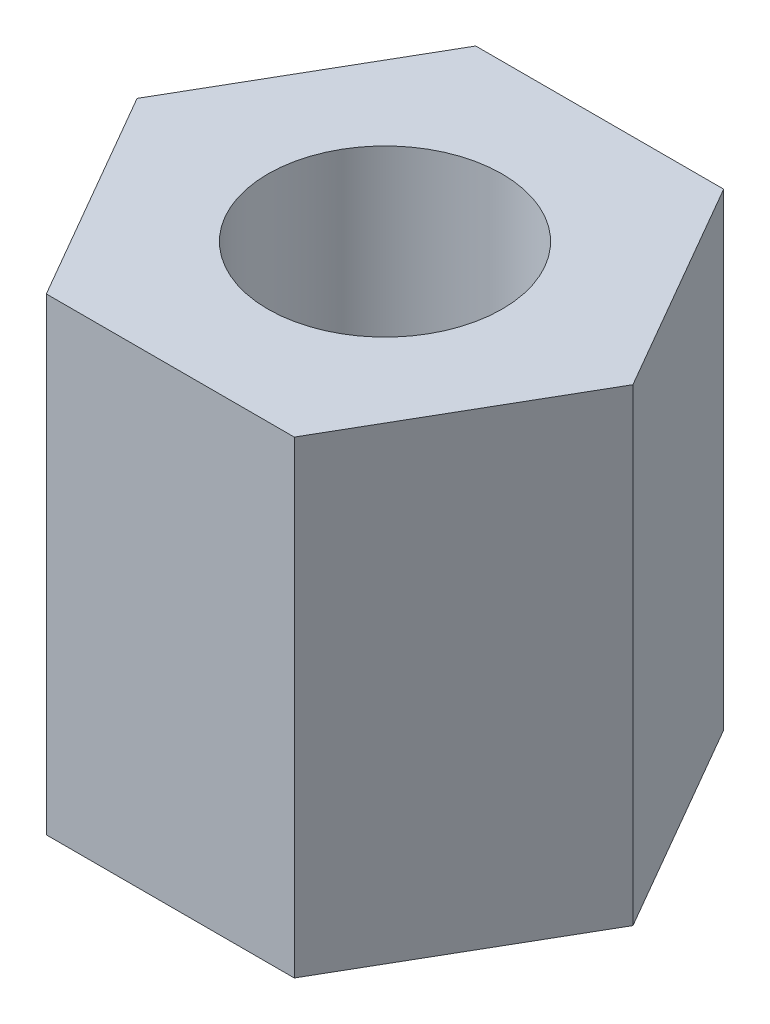
ISO-10303-21;
HEADER;
FILE_DESCRIPTION(('STEP AP214'),'2;1');
FILE_NAME('part.step','',(''),(''),'','','');
FILE_SCHEMA(('AUTOMOTIVE_DESIGN { 1 0 10303 214 1 1 1 1 }'));
ENDSEC;
DATA;
#1=APPLICATION_CONTEXT('core data for automotive mechanical design processes');
#2=APPLICATION_PROTOCOL_DEFINITION('international standard','automotive_design',2000,#1);
#3=PRODUCT_CONTEXT('',#1,'mechanical');
#4=PRODUCT('Part','Part','',(#3));
#5=PRODUCT_RELATED_PRODUCT_CATEGORY('part','',(#4));
#6=PRODUCT_DEFINITION_FORMATION('','',#4);
#7=PRODUCT_DEFINITION_CONTEXT('part definition',#1,'design');
#8=PRODUCT_DEFINITION('design','',#6,#7);
#9=PRODUCT_DEFINITION_SHAPE('','',#8);
#10=(LENGTH_UNIT() NAMED_UNIT(*) SI_UNIT(.MILLI.,.METRE.));
#11=(NAMED_UNIT(*) PLANE_ANGLE_UNIT() SI_UNIT($,.RADIAN.));
#12=(NAMED_UNIT(*) SI_UNIT($,.STERADIAN.) SOLID_ANGLE_UNIT());
#13=UNCERTAINTY_MEASURE_WITH_UNIT(LENGTH_MEASURE(1.E-05),#10,'distance_accuracy_value','');
#14=(GEOMETRIC_REPRESENTATION_CONTEXT(3) GLOBAL_UNCERTAINTY_ASSIGNED_CONTEXT((#13)) GLOBAL_UNIT_ASSIGNED_CONTEXT((#10,
#11,#12)) REPRESENTATION_CONTEXT('',''));
#15=CARTESIAN_POINT('',(0.,0.,0.));
#16=DIRECTION('',(0.,0.,1.));
#17=DIRECTION('',(1.,0.,0.));
#18=AXIS2_PLACEMENT_3D('',#15,#16,#17);
#19=CARTESIAN_POINT('',(0.,6.,0.));
#20=DIRECTION('',(0.,1.,0.));
#21=DIRECTION('',(0.,0.,1.));
#22=AXIS2_PLACEMENT_3D('',#19,#20,#21);
#23=PLANE('',#22);
#24=DIRECTION('',(-0.5,0.,-0.866025403784439));
#25=VECTOR('',#24,1.);
#26=CARTESIAN_POINT('',(3.17542648054294,6.,0.));
#27=LINE('',#26,#25);
#28=CARTESIAN_POINT('',(3.17542648054294,6.,0.));
#29=VERTEX_POINT('',#28);
#30=CARTESIAN_POINT('',(1.58771324027147,6.,-2.75));
#31=VERTEX_POINT('',#30);
#32=EDGE_CURVE('E146',#29,#31,#27,.T.);
#33=ORIENTED_EDGE('',*,*,#32,.T.);
#34=DIRECTION('',(-1.,0.,0.));
#35=VECTOR('',#34,1.);
#36=CARTESIAN_POINT('',(1.58771324027147,6.,-2.75));
#37=LINE('',#36,#35);
#38=CARTESIAN_POINT('',(-1.58771324027147,6.,-2.75));
#39=VERTEX_POINT('',#38);
#40=EDGE_CURVE('E94',#31,#39,#37,.T.);
#41=ORIENTED_EDGE('',*,*,#40,.T.);
#42=DIRECTION('',(-0.5,0.,0.866025403784439));
#43=VECTOR('',#42,1.);
#44=CARTESIAN_POINT('',(-1.58771324027147,6.,-2.75));
#45=LINE('',#44,#43);
#46=CARTESIAN_POINT('',(-3.17542648054294,6.,0.));
#47=VERTEX_POINT('',#46);
#48=EDGE_CURVE('E107',#39,#47,#45,.T.);
#49=ORIENTED_EDGE('',*,*,#48,.T.);
#50=DIRECTION('',(0.5,0.,0.866025403784438));
#51=VECTOR('',#50,1.);
#52=CARTESIAN_POINT('',(-3.17542648054294,6.,0.));
#53=LINE('',#52,#51);
#54=CARTESIAN_POINT('',(-1.58771324027147,6.,2.75));
#55=VERTEX_POINT('',#54);
#56=EDGE_CURVE('E101',#47,#55,#53,.T.);
#57=ORIENTED_EDGE('',*,*,#56,.T.);
#58=DIRECTION('',(1.,0.,0.));
#59=VECTOR('',#58,1.);
#60=CARTESIAN_POINT('',(-1.58771324027147,6.,2.75));
#61=LINE('',#60,#59);
#62=CARTESIAN_POINT('',(1.58771324027147,6.,2.75));
#63=VERTEX_POINT('',#62);
#64=EDGE_CURVE('E105',#55,#63,#61,.T.);
#65=ORIENTED_EDGE('',*,*,#64,.T.);
#66=DIRECTION('',(0.5,0.,-0.866025403784439));
#67=VECTOR('',#66,1.);
#68=CARTESIAN_POINT('',(1.58771324027147,6.,2.75));
#69=LINE('',#68,#67);
#70=EDGE_CURVE('E57',#63,#29,#69,.T.);
#71=ORIENTED_EDGE('',*,*,#70,.T.);
#72=EDGE_LOOP('',(#33,#41,#49,#57,#65,#71));
#73=FACE_BOUND('',#72,.T.);
#74=CARTESIAN_POINT('',(0.,6.,0.));
#75=DIRECTION('',(0.,1.,0.));
#76=DIRECTION('',(0.,0.,1.));
#77=AXIS2_PLACEMENT_3D('',#74,#75,#76);
#78=CIRCLE('',#77,1.5);
#79=CARTESIAN_POINT('',(0.,6.,1.5));
#80=VERTEX_POINT('',#79);
#81=EDGE_CURVE('E134',#80,#80,#78,.T.);
#82=ORIENTED_EDGE('',*,*,#81,.F.);
#83=EDGE_LOOP('',(#82));
#84=FACE_BOUND('',#83,.T.);
#85=ADVANCED_FACE('F39',(#73,#84),#23,.T.);
#86=CARTESIAN_POINT('',(0.,0.,0.));
#87=DIRECTION('',(0.,1.,0.));
#88=DIRECTION('',(0.,0.,1.));
#89=AXIS2_PLACEMENT_3D('',#86,#87,#88);
#90=PLANE('',#89);
#91=DIRECTION('',(-0.5,0.,-0.866025403784439));
#92=VECTOR('',#91,1.);
#93=CARTESIAN_POINT('',(3.17542648054294,0.,0.));
#94=LINE('',#93,#92);
#95=CARTESIAN_POINT('',(3.17542648054294,0.,0.));
#96=VERTEX_POINT('',#95);
#97=CARTESIAN_POINT('',(1.58771324027147,0.,-2.75));
#98=VERTEX_POINT('',#97);
#99=EDGE_CURVE('E129',#96,#98,#94,.T.);
#100=ORIENTED_EDGE('',*,*,#99,.F.);
#101=DIRECTION('',(0.5,0.,-0.866025403784439));
#102=VECTOR('',#101,1.);
#103=CARTESIAN_POINT('',(1.58771324027147,0.,2.75));
#104=LINE('',#103,#102);
#105=CARTESIAN_POINT('',(1.58771324027147,0.,2.75));
#106=VERTEX_POINT('',#105);
#107=EDGE_CURVE('E86',#106,#96,#104,.T.);
#108=ORIENTED_EDGE('',*,*,#107,.F.);
#109=DIRECTION('',(1.,0.,0.));
#110=VECTOR('',#109,1.);
#111=CARTESIAN_POINT('',(-1.58771324027147,0.,2.75));
#112=LINE('',#111,#110);
#113=CARTESIAN_POINT('',(-1.58771324027147,0.,2.75));
#114=VERTEX_POINT('',#113);
#115=EDGE_CURVE('E80',#114,#106,#112,.T.);
#116=ORIENTED_EDGE('',*,*,#115,.F.);
#117=DIRECTION('',(0.5,0.,0.866025403784438));
#118=VECTOR('',#117,1.);
#119=CARTESIAN_POINT('',(-3.17542648054294,0.,0.));
#120=LINE('',#119,#118);
#121=CARTESIAN_POINT('',(-3.17542648054294,0.,0.));
#122=VERTEX_POINT('',#121);
#123=EDGE_CURVE('E116',#122,#114,#120,.T.);
#124=ORIENTED_EDGE('',*,*,#123,.F.);
#125=DIRECTION('',(-0.5,0.,0.866025403784439));
#126=VECTOR('',#125,1.);
#127=CARTESIAN_POINT('',(-1.58771324027147,0.,-2.75));
#128=LINE('',#127,#126);
#129=CARTESIAN_POINT('',(-1.58771324027147,0.,-2.75));
#130=VERTEX_POINT('',#129);
#131=EDGE_CURVE('E137',#130,#122,#128,.T.);
#132=ORIENTED_EDGE('',*,*,#131,.F.);
#133=DIRECTION('',(-1.,0.,0.));
#134=VECTOR('',#133,1.);
#135=CARTESIAN_POINT('',(1.58771324027147,0.,-2.75));
#136=LINE('',#135,#134);
#137=EDGE_CURVE('E133',#98,#130,#136,.T.);
#138=ORIENTED_EDGE('',*,*,#137,.F.);
#139=EDGE_LOOP('',(#100,#108,#116,#124,#132,#138));
#140=FACE_BOUND('',#139,.T.);
#141=CARTESIAN_POINT('',(0.,0.,0.));
#142=DIRECTION('',(0.,1.,0.));
#143=DIRECTION('',(0.,0.,1.));
#144=AXIS2_PLACEMENT_3D('',#141,#142,#143);
#145=CIRCLE('',#144,1.5);
#146=CARTESIAN_POINT('',(0.,0.,1.5));
#147=VERTEX_POINT('',#146);
#148=EDGE_CURVE('E243',#147,#147,#145,.T.);
#149=ORIENTED_EDGE('',*,*,#148,.T.);
#150=EDGE_LOOP('',(#149));
#151=FACE_BOUND('',#150,.T.);
#152=ADVANCED_FACE('F159',(#140,#151),#90,.F.);
#153=CARTESIAN_POINT('',(3.17542648054294,6.,0.));
#154=DIRECTION('',(-0.866025403784438,0.,0.5));
#155=DIRECTION('',(0.5,0.,0.866025403784439));
#156=AXIS2_PLACEMENT_3D('',#153,#154,#155);
#157=PLANE('',#156);
#158=ORIENTED_EDGE('',*,*,#99,.T.);
#159=DIRECTION('',(0.,-1.,0.));
#160=VECTOR('',#159,1.);
#161=CARTESIAN_POINT('',(1.58771324027147,6.,-2.75));
#162=LINE('',#161,#160);
#163=EDGE_CURVE('E11',#31,#98,#162,.T.);
#164=ORIENTED_EDGE('',*,*,#163,.F.);
#165=ORIENTED_EDGE('',*,*,#32,.F.);
#166=DIRECTION('',(0.,-1.,0.));
#167=VECTOR('',#166,1.);
#168=CARTESIAN_POINT('',(3.17542648054294,6.,0.));
#169=LINE('',#168,#167);
#170=EDGE_CURVE('E125',#29,#96,#169,.T.);
#171=ORIENTED_EDGE('',*,*,#170,.T.);
#172=EDGE_LOOP('',(#158,#164,#165,#171));
#173=FACE_BOUND('',#172,.T.);
#174=ADVANCED_FACE('F41',(#173),#157,.F.);
#175=CARTESIAN_POINT('',(1.58771324027147,6.,-2.75));
#176=DIRECTION('',(0.,0.,1.));
#177=DIRECTION('',(1.,0.,0.));
#178=AXIS2_PLACEMENT_3D('',#175,#176,#177);
#179=PLANE('',#178);
#180=ORIENTED_EDGE('',*,*,#137,.T.);
#181=DIRECTION('',(0.,-1.,0.));
#182=VECTOR('',#181,1.);
#183=CARTESIAN_POINT('',(-1.58771324027147,6.,-2.75));
#184=LINE('',#183,#182);
#185=EDGE_CURVE('E49',#39,#130,#184,.T.);
#186=ORIENTED_EDGE('',*,*,#185,.F.);
#187=ORIENTED_EDGE('',*,*,#40,.F.);
#188=ORIENTED_EDGE('',*,*,#163,.T.);
#189=EDGE_LOOP('',(#180,#186,#187,#188));
#190=FACE_BOUND('',#189,.T.);
#191=ADVANCED_FACE('F184',(#190),#179,.F.);
#192=CARTESIAN_POINT('',(-1.58771324027147,6.,-2.75));
#193=DIRECTION('',(0.866025403784439,0.,0.5));
#194=DIRECTION('',(0.5,0.,-0.866025403784439));
#195=AXIS2_PLACEMENT_3D('',#192,#193,#194);
#196=PLANE('',#195);
#197=ORIENTED_EDGE('',*,*,#131,.T.);
#198=DIRECTION('',(0.,-1.,0.));
#199=VECTOR('',#198,1.);
#200=CARTESIAN_POINT('',(-3.17542648054294,6.,0.));
#201=LINE('',#200,#199);
#202=EDGE_CURVE('E118',#47,#122,#201,.T.);
#203=ORIENTED_EDGE('',*,*,#202,.F.);
#204=ORIENTED_EDGE('',*,*,#48,.F.);
#205=ORIENTED_EDGE('',*,*,#185,.T.);
#206=EDGE_LOOP('',(#197,#203,#204,#205));
#207=FACE_BOUND('',#206,.T.);
#208=ADVANCED_FACE('F156',(#207),#196,.F.);
#209=CARTESIAN_POINT('',(-3.17542648054294,6.,0.));
#210=DIRECTION('',(0.866025403784438,0.,-0.5));
#211=DIRECTION('',(-0.5,0.,-0.866025403784438));
#212=AXIS2_PLACEMENT_3D('',#209,#210,#211);
#213=PLANE('',#212);
#214=ORIENTED_EDGE('',*,*,#123,.T.);
#215=DIRECTION('',(0.,-1.,0.));
#216=VECTOR('',#215,1.);
#217=CARTESIAN_POINT('',(-1.58771324027147,6.,2.75));
#218=LINE('',#217,#216);
#219=EDGE_CURVE('E113',#55,#114,#218,.T.);
#220=ORIENTED_EDGE('',*,*,#219,.F.);
#221=ORIENTED_EDGE('',*,*,#56,.F.);
#222=ORIENTED_EDGE('',*,*,#202,.T.);
#223=EDGE_LOOP('',(#214,#220,#221,#222));
#224=FACE_BOUND('',#223,.T.);
#225=ADVANCED_FACE('F114',(#224),#213,.F.);
#226=CARTESIAN_POINT('',(-1.58771324027147,6.,2.75));
#227=DIRECTION('',(0.,0.,-1.));
#228=DIRECTION('',(-1.,0.,0.));
#229=AXIS2_PLACEMENT_3D('',#226,#227,#228);
#230=PLANE('',#229);
#231=ORIENTED_EDGE('',*,*,#115,.T.);
#232=DIRECTION('',(0.,-1.,0.));
#233=VECTOR('',#232,1.);
#234=CARTESIAN_POINT('',(1.58771324027147,6.,2.75));
#235=LINE('',#234,#233);
#236=EDGE_CURVE('E119',#63,#106,#235,.T.);
#237=ORIENTED_EDGE('',*,*,#236,.F.);
#238=ORIENTED_EDGE('',*,*,#64,.F.);
#239=ORIENTED_EDGE('',*,*,#219,.T.);
#240=EDGE_LOOP('',(#231,#237,#238,#239));
#241=FACE_BOUND('',#240,.T.);
#242=ADVANCED_FACE('F121',(#241),#230,.F.);
#243=CARTESIAN_POINT('',(1.58771324027147,6.,2.75));
#244=DIRECTION('',(-0.866025403784439,0.,-0.5));
#245=DIRECTION('',(-0.5,0.,0.866025403784439));
#246=AXIS2_PLACEMENT_3D('',#243,#244,#245);
#247=PLANE('',#246);
#248=ORIENTED_EDGE('',*,*,#107,.T.);
#249=ORIENTED_EDGE('',*,*,#170,.F.);
#250=ORIENTED_EDGE('',*,*,#70,.F.);
#251=ORIENTED_EDGE('',*,*,#236,.T.);
#252=EDGE_LOOP('',(#248,#249,#250,#251));
#253=FACE_BOUND('',#252,.T.);
#254=ADVANCED_FACE('F164',(#253),#247,.F.);
#255=CARTESIAN_POINT('',(0.,6.,0.));
#256=DIRECTION('',(0.,-1.,0.));
#257=DIRECTION('',(0.,0.,-1.));
#258=AXIS2_PLACEMENT_3D('',#255,#256,#257);
#259=CYLINDRICAL_SURFACE('',#258,1.5);
#260=ORIENTED_EDGE('',*,*,#81,.T.);
#261=EDGE_LOOP('',(#260));
#262=FACE_BOUND('',#261,.T.);
#263=ORIENTED_EDGE('',*,*,#148,.F.);
#264=EDGE_LOOP('',(#263));
#265=FACE_BOUND('',#264,.T.);
#266=ADVANCED_FACE('F166',(#262,#265),#259,.F.);
#267=CLOSED_SHELL('',(#85,#152,#174,#191,#208,#225,#242,#254,#266));
#268=MANIFOLD_SOLID_BREP('B2',#267);
#269=ADVANCED_BREP_SHAPE_REPRESENTATION('',(#18,#268),#14);
#270=SHAPE_DEFINITION_REPRESENTATION(#9,#269);
ENDSEC;
END-ISO-10303-21;
